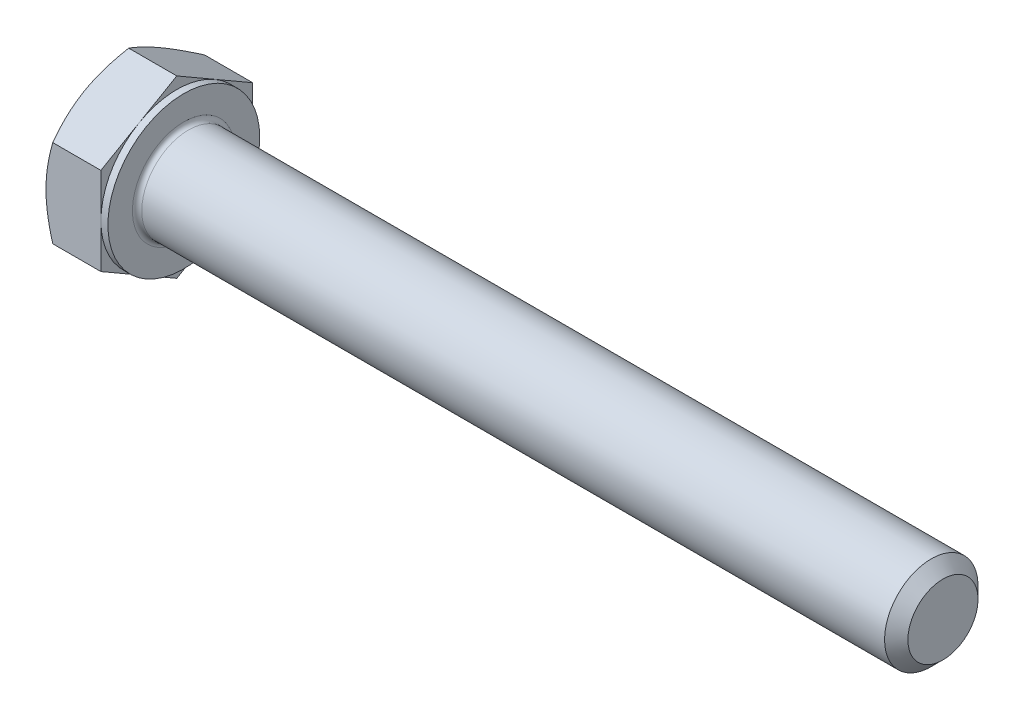
ISO-10303-21;
HEADER;
FILE_DESCRIPTION(('STEP AP214'),'2;1');
FILE_NAME('part.step','',(''),(''),'','','');
FILE_SCHEMA(('AUTOMOTIVE_DESIGN { 1 0 10303 214 1 1 1 1 }'));
ENDSEC;
DATA;
#1=APPLICATION_CONTEXT('core data for automotive mechanical design processes');
#2=APPLICATION_PROTOCOL_DEFINITION('international standard','automotive_design',2000,#1);
#3=PRODUCT_CONTEXT('',#1,'mechanical');
#4=PRODUCT('Part','Part','',(#3));
#5=PRODUCT_RELATED_PRODUCT_CATEGORY('part','',(#4));
#6=PRODUCT_DEFINITION_FORMATION('','',#4);
#7=PRODUCT_DEFINITION_CONTEXT('part definition',#1,'design');
#8=PRODUCT_DEFINITION('design','',#6,#7);
#9=PRODUCT_DEFINITION_SHAPE('','',#8);
#10=(LENGTH_UNIT() NAMED_UNIT(*) SI_UNIT(.MILLI.,.METRE.));
#11=(NAMED_UNIT(*) PLANE_ANGLE_UNIT() SI_UNIT($,.RADIAN.));
#12=(NAMED_UNIT(*) SI_UNIT($,.STERADIAN.) SOLID_ANGLE_UNIT());
#13=UNCERTAINTY_MEASURE_WITH_UNIT(LENGTH_MEASURE(1.E-05),#10,'distance_accuracy_value','');
#14=(GEOMETRIC_REPRESENTATION_CONTEXT(3) GLOBAL_UNCERTAINTY_ASSIGNED_CONTEXT((#13)) GLOBAL_UNIT_ASSIGNED_CONTEXT((#10,
#11,#12)) REPRESENTATION_CONTEXT('',''));
#15=CARTESIAN_POINT('',(0.,0.,0.));
#16=DIRECTION('',(0.,0.,1.));
#17=DIRECTION('',(1.,0.,0.));
#18=AXIS2_PLACEMENT_3D('',#15,#16,#17);
#19=CARTESIAN_POINT('',(5.3,3.75277674973256,-6.5));
#20=DIRECTION('',(0.,-0.866025403784438,0.500000000000001));
#21=DIRECTION('',(0.,-0.500000000000001,-0.866025403784438));
#22=AXIS2_PLACEMENT_3D('',#19,#20,#21);
#23=PLANE('',#22);
#24=DIRECTION('',(0.,0.500000000000001,0.866025403784438));
#25=VECTOR('',#24,1.);
#26=CARTESIAN_POINT('',(4.7,3.75277674973256,-6.5));
#27=LINE('',#26,#25);
#28=CARTESIAN_POINT('',(4.7,3.75277674973256,-6.5));
#29=VERTEX_POINT('',#28);
#30=CARTESIAN_POINT('',(4.7,5.62916512459885,-3.25));
#31=VERTEX_POINT('',#30);
#32=EDGE_CURVE('E179',#29,#31,#27,.T.);
#33=ORIENTED_EDGE('',*,*,#32,.F.);
#34=DIRECTION('',(-1.,0.,0.));
#35=VECTOR('',#34,1.);
#36=CARTESIAN_POINT('',(5.3,3.75277674973256,-6.5));
#37=LINE('',#36,#35);
#38=CARTESIAN_POINT('',(0.580556583600761,3.75277674973256,-6.5));
#39=VERTEX_POINT('',#38);
#40=EDGE_CURVE('E309',#29,#39,#37,.T.);
#41=ORIENTED_EDGE('',*,*,#40,.T.);
#42=CARTESIAN_POINT('',(0.580623251805869,7.50566896951898,0.0002));
#43=CARTESIAN_POINT('',(0.533004423075487,7.4231786300702,-0.14267745905888));
#44=CARTESIAN_POINT('',(0.487546700602708,7.34038072665458,-0.286087634534913));
#45=CARTESIAN_POINT('',(0.401548682023047,7.17411251123976,-0.574072631317195));
#46=CARTESIAN_POINT('',(0.361010507228027,7.09064192560665,-0.718647926571264));
#47=CARTESIAN_POINT('',(0.24757100112321,6.83889369625719,-1.15468865052003));
#48=CARTESIAN_POINT('',(0.183047807128741,6.66962231516081,-1.44787528284632));
#49=CARTESIAN_POINT('',(0.107386583547492,6.41631077211555,-1.88662374554437));
#50=CARTESIAN_POINT('',(0.0858328564569881,6.33302748139454,-2.03087463649469));
#51=CARTESIAN_POINT('',(0.0496903146061193,6.16608458377293,-2.32002821713809));
#52=CARTESIAN_POINT('',(0.0351008844596669,6.08242501078143,-2.46493084809889));
#53=CARTESIAN_POINT('',(0.0132587525073471,5.91496056339806,-2.75498777942832));
#54=CARTESIAN_POINT('',(0.00599772432210794,5.8311559625217,-2.90014160605421));
#55=CARTESIAN_POINT('',(-0.00103969741776869,5.66347396979287,-3.19057533697495));
#56=CARTESIAN_POINT('',(-0.000816322187795487,5.5795965802691,-3.33585523723636));
#57=CARTESIAN_POINT('',(0.010083458515165,5.34979921898453,-3.73387594242649));
#58=CARTESIAN_POINT('',(0.028381817869413,5.20395446807007,-3.98648646102757));
#59=CARTESIAN_POINT('',(0.0864063414576743,4.91323365606635,-4.49002967823568));
#60=CARTESIAN_POINT('',(0.126152338538243,4.76835861741226,-4.74096060593308));
#61=CARTESIAN_POINT('',(0.225505903202148,4.47705272008731,-5.24551722064432));
#62=CARTESIAN_POINT('',(0.285534425638025,4.33065861912702,-5.49907924143591));
#63=CARTESIAN_POINT('',(0.421774992509866,4.04005357906493,-6.00242193575904));
#64=CARTESIAN_POINT('',(0.497955034163591,3.89583891821181,-6.25220905555296));
#65=CARTESIAN_POINT('',(0.580623251805865,3.75266127967873,-6.5002));
#66=B_SPLINE_CURVE_WITH_KNOTS('',3,(#42,#43,#44,#45,#46,#47,#48,#49,#50,#51,#52,#53,#54,#55,#56,
#57,#58,#59,#60,#61,#62,#63,#64,#65),.UNSPECIFIED.,.F.,.F.,(4,2,2,2,2,2,2,2,2,2,2,4),(0.,
0.515105052395588,1.03043143507525,2.06322554824262,2.56697389547996,3.07067772176454,
3.57380860368928,4.0769239424252,4.9527935470566,5.82947446853466,6.72559912449737,
7.61996451221046),.UNSPECIFIED.);
#67=CARTESIAN_POINT('',(0.,5.62916512459885,-3.25000000000001));
#68=VERTEX_POINT('',#67);
#69=EDGE_CURVE('E234',#68,#39,#66,.T.);
#70=ORIENTED_EDGE('',*,*,#69,.F.);
#71=CARTESIAN_POINT('',(0.580556583600765,7.50555349946514,0.));
#72=VERTEX_POINT('',#71);
#73=EDGE_CURVE('E70',#72,#68,#66,.T.);
#74=ORIENTED_EDGE('',*,*,#73,.F.);
#75=DIRECTION('',(-1.,0.,0.));
#76=VECTOR('',#75,1.);
#77=CARTESIAN_POINT('',(5.3,7.50555349946514,0.));
#78=LINE('',#77,#76);
#79=CARTESIAN_POINT('',(4.7,7.50555349946514,0.));
#80=VERTEX_POINT('',#79);
#81=EDGE_CURVE('E301',#80,#72,#78,.T.);
#82=ORIENTED_EDGE('',*,*,#81,.F.);
#83=EDGE_CURVE('E177',#31,#80,#27,.T.);
#84=ORIENTED_EDGE('',*,*,#83,.F.);
#85=EDGE_LOOP('',(#33,#41,#70,#74,#82,#84));
#86=FACE_BOUND('',#85,.T.);
#87=ADVANCED_FACE('F47',(#86),#23,.F.);
#88=CARTESIAN_POINT('',(5.3,7.50555349946514,0.));
#89=DIRECTION('',(0.,-0.866025403784438,-0.500000000000001));
#90=DIRECTION('',(0.,0.500000000000001,-0.866025403784438));
#91=AXIS2_PLACEMENT_3D('',#88,#89,#90);
#92=PLANE('',#91);
#93=DIRECTION('',(0.,-0.500000000000001,0.866025403784438));
#94=VECTOR('',#93,1.);
#95=CARTESIAN_POINT('',(4.7,7.50555349946514,0.));
#96=LINE('',#95,#94);
#97=CARTESIAN_POINT('',(4.7,5.62916512459885,3.25000000000001));
#98=VERTEX_POINT('',#97);
#99=EDGE_CURVE('E176',#80,#98,#96,.T.);
#100=ORIENTED_EDGE('',*,*,#99,.F.);
#101=ORIENTED_EDGE('',*,*,#81,.T.);
#102=CARTESIAN_POINT('',(0.580623251805865,3.75266127967872,6.5002));
#103=CARTESIAN_POINT('',(0.533004423075483,3.8351516191275,6.35732254094112));
#104=CARTESIAN_POINT('',(0.487546700602704,3.91794952254312,6.21391236546509));
#105=CARTESIAN_POINT('',(0.401548682023044,4.08421773795794,5.9259273686828));
#106=CARTESIAN_POINT('',(0.361010507228023,4.16768832359105,5.78135207342873));
#107=CARTESIAN_POINT('',(0.247571001123207,4.41943655294051,5.34531134947996));
#108=CARTESIAN_POINT('',(0.183047807128738,4.58870793403689,5.05212471715368));
#109=CARTESIAN_POINT('',(0.10738658354749,4.84201947708215,4.61337625445563));
#110=CARTESIAN_POINT('',(0.0858328564569865,4.92530276780316,4.46912536350531));
#111=CARTESIAN_POINT('',(0.0496903146061183,5.09224566542477,4.17997178286191));
#112=CARTESIAN_POINT('',(0.035100884459666,5.17590523841627,4.03506915190111));
#113=CARTESIAN_POINT('',(0.0132587525073465,5.34336968579964,3.74501222057168));
#114=CARTESIAN_POINT('',(0.00599772432210779,5.427174286676,3.59985839394579));
#115=CARTESIAN_POINT('',(-0.00103969741776854,5.59485627940483,3.30942466302505));
#116=CARTESIAN_POINT('',(-0.000816322187795452,5.6787336689286,3.16414476276364));
#117=CARTESIAN_POINT('',(0.010083458515165,5.90853103021317,2.76612405757351));
#118=CARTESIAN_POINT('',(0.0283818178694132,6.05437578112763,2.51351353897243));
#119=CARTESIAN_POINT('',(0.0864063414576753,6.34509659313135,2.00997032176432));
#120=CARTESIAN_POINT('',(0.126152338538245,6.48997163178545,1.75903939406692));
#121=CARTESIAN_POINT('',(0.22550590320215,6.78127752911039,1.25448277935568));
#122=CARTESIAN_POINT('',(0.285534425638028,6.92767163007068,1.00092075856409));
#123=CARTESIAN_POINT('',(0.42177499250987,7.21827667013277,0.497578064240955));
#124=CARTESIAN_POINT('',(0.497955034163595,7.36249133098589,0.247790944447036));
#125=CARTESIAN_POINT('',(0.580623251805869,7.50566896951898,-0.000200000000000213));
#126=B_SPLINE_CURVE_WITH_KNOTS('',3,(#102,#103,#104,#105,#106,#107,#108,#109,#110,#111,#112,
#113,#114,#115,#116,#117,#118,#119,#120,#121,#122,#123,#124,#125),.UNSPECIFIED.,.F.,.F.,(4,2,2,
2,2,2,2,2,2,2,2,4),(0.,0.515105052395587,1.03043143507524,2.06322554824262,2.56697389547996,
3.07067772176454,3.57380860368928,4.0769239424252,4.9527935470566,5.82947446853466,
6.72559912449737,7.61996451221046),.UNSPECIFIED.);
#127=CARTESIAN_POINT('',(0.,5.62916512459885,3.25000000000001));
#128=VERTEX_POINT('',#127);
#129=EDGE_CURVE('E231',#128,#72,#126,.T.);
#130=ORIENTED_EDGE('',*,*,#129,.F.);
#131=CARTESIAN_POINT('',(0.58055658360076,3.75277674973256,6.5));
#132=VERTEX_POINT('',#131);
#133=EDGE_CURVE('E245',#132,#128,#126,.T.);
#134=ORIENTED_EDGE('',*,*,#133,.F.);
#135=DIRECTION('',(-1.,0.,0.));
#136=VECTOR('',#135,1.);
#137=CARTESIAN_POINT('',(5.3,3.75277674973256,6.5));
#138=LINE('',#137,#136);
#139=CARTESIAN_POINT('',(4.7,3.75277674973256,6.5));
#140=VERTEX_POINT('',#139);
#141=EDGE_CURVE('E303',#140,#132,#138,.T.);
#142=ORIENTED_EDGE('',*,*,#141,.F.);
#143=EDGE_CURVE('E144',#98,#140,#96,.T.);
#144=ORIENTED_EDGE('',*,*,#143,.F.);
#145=EDGE_LOOP('',(#100,#101,#130,#134,#142,#144));
#146=FACE_BOUND('',#145,.T.);
#147=ADVANCED_FACE('F252',(#146),#92,.F.);
#148=CARTESIAN_POINT('',(5.3,3.75277674973256,6.5));
#149=DIRECTION('',(0.,0.,-1.));
#150=DIRECTION('',(0.,1.,0.));
#151=AXIS2_PLACEMENT_3D('',#148,#149,#150);
#152=PLANE('',#151);
#153=DIRECTION('',(0.,-1.,0.));
#154=VECTOR('',#153,1.);
#155=CARTESIAN_POINT('',(4.7,3.75277674973256,6.5));
#156=LINE('',#155,#154);
#157=CARTESIAN_POINT('',(4.7,0.,6.5));
#158=VERTEX_POINT('',#157);
#159=EDGE_CURVE('E138',#140,#158,#156,.T.);
#160=ORIENTED_EDGE('',*,*,#159,.F.);
#161=ORIENTED_EDGE('',*,*,#141,.T.);
#162=CARTESIAN_POINT('',(3.18835311590246,-10.1137456678934,6.5));
#163=CARTESIAN_POINT('',(3.05034774010468,-9.82952666322138,6.5));
#164=CARTESIAN_POINT('',(2.91365616489938,-9.54465869649274,6.5));
#165=CARTESIAN_POINT('',(2.64363899497542,-8.97327978057922,6.5));
#166=CARTESIAN_POINT('',(2.51031392459097,-8.68676858388472,6.5));
#167=CARTESIAN_POINT('',(2.24710473482719,-8.11029837842689,6.5));
#168=CARTESIAN_POINT('',(2.1172430043868,-7.82032911201512,6.5));
#169=CARTESIAN_POINT('',(1.86279082826903,-7.2380954102234,6.5));
#170=CARTESIAN_POINT('',(1.73820013554674,-6.94583108317207,6.5));
#171=CARTESIAN_POINT('',(1.49176685426962,-6.34906440963036,6.5));
#172=CARTESIAN_POINT('',(1.37014257641266,-6.04447142288872,6.5));
#173=CARTESIAN_POINT('',(1.1360186575815,-5.43173420957316,6.5));
#174=CARTESIAN_POINT('',(1.02352003558022,-5.12358959079846,6.5));
#175=CARTESIAN_POINT('',(0.810575368239919,-4.5038256978226,6.5));
#176=CARTESIAN_POINT('',(0.710105232302007,-4.19221478266993,6.5));
#177=CARTESIAN_POINT('',(0.524420166144455,-3.56452019206012,6.5));
#178=CARTESIAN_POINT('',(0.439200468206419,-3.24843794792921,6.5));
#179=CARTESIAN_POINT('',(0.288524223401198,-2.61335465712783,6.5));
#180=CARTESIAN_POINT('',(0.222961865744749,-2.29437912059505,6.5));
#181=CARTESIAN_POINT('',(0.115312883130725,-1.65238219405863,6.5));
#182=CARTESIAN_POINT('',(0.0732239014690639,-1.3293612135443,6.5));
#183=CARTESIAN_POINT('',(0.0304887136381667,-0.845231171839986,6.5));
#184=CARTESIAN_POINT('',(0.0196493434273843,-0.684982209663104,6.5));
#185=CARTESIAN_POINT('',(0.00475298486143984,-0.364162349065462,6.5));
#186=CARTESIAN_POINT('',(0.000695882908832057,-0.203591456081881,6.5));
#187=CARTESIAN_POINT('',(-0.000531597190095015,0.117577430374295,6.5));
#188=CARTESIAN_POINT('',(0.00229809017012692,0.278175424090141,6.5));
#189=CARTESIAN_POINT('',(0.0147726845547639,0.599108972823504,6.5));
#190=CARTESIAN_POINT('',(0.0244179260500518,0.759444514574217,6.5));
#191=CARTESIAN_POINT('',(0.0554961939342999,1.14369946602534,6.5));
#192=CARTESIAN_POINT('',(0.0801030490514514,1.36736763045086,6.5));
#193=CARTESIAN_POINT('',(0.141246537453377,1.81305591311687,6.5));
#194=CARTESIAN_POINT('',(0.177784759614452,2.03507580783108,6.5));
#195=CARTESIAN_POINT('',(0.303360001332116,2.69839633433795,6.5));
#196=CARTESIAN_POINT('',(0.408335815147595,3.13672010374357,6.5));
#197=CARTESIAN_POINT('',(0.59056459313494,3.79232112918118,6.5));
#198=CARTESIAN_POINT('',(0.656313198979091,4.01299150874073,6.5));
#199=CARTESIAN_POINT('',(0.794681634200732,4.45218859008391,6.5));
#200=CARTESIAN_POINT('',(0.867301513122617,4.67071527639819,6.5));
#201=CARTESIAN_POINT('',(1.01824353854295,5.10569490252726,6.5));
#202=CARTESIAN_POINT('',(1.09656388232839,5.32214847365075,6.5));
#203=CARTESIAN_POINT('',(1.25798086164821,5.75325725773039,6.5));
#204=CARTESIAN_POINT('',(1.34107741035995,5.96791250329556,6.5));
#205=CARTESIAN_POINT('',(1.56029019583041,6.51888445936372,6.5));
#206=CARTESIAN_POINT('',(1.69936356666534,6.85402316813626,6.5));
#207=CARTESIAN_POINT('',(1.98501958087353,7.52109583939392,6.5));
#208=CARTESIAN_POINT('',(2.13160288780791,7.85302951559932,6.5));
#209=CARTESIAN_POINT('',(2.43059748044951,8.51437865518657,6.5));
#210=CARTESIAN_POINT('',(2.58301057596959,8.84379329784093,6.5));
#211=CARTESIAN_POINT('',(2.89234869374926,9.50047798683784,6.5));
#212=CARTESIAN_POINT('',(3.04927357220058,9.82774810112756,6.5));
#213=CARTESIAN_POINT('',(3.36692013130636,10.4809971975748,6.5));
#214=CARTESIAN_POINT('',(3.52764676491733,10.8069737667408,6.5));
#215=CARTESIAN_POINT('',(3.85198555554899,11.4574882901034,6.5));
#216=CARTESIAN_POINT('',(4.01559773123065,11.7820262349792,6.5));
#217=CARTESIAN_POINT('',(4.50986185003773,12.753746811444,6.5));
#218=CARTESIAN_POINT('',(4.84399997978541,13.3991555932469,6.5));
#219=CARTESIAN_POINT('',(5.48575990265919,14.6239779290894,6.5));
#220=CARTESIAN_POINT('',(5.79279643372278,15.2036995760604,6.5));
#221=CARTESIAN_POINT('',(6.4106918822763,16.3611382637875,6.5));
#222=CARTESIAN_POINT('',(6.72155099010109,16.938855202873,6.5));
#223=CARTESIAN_POINT('',(7.34519775439014,18.0910273555999,6.5));
#224=CARTESIAN_POINT('',(7.65797694168864,18.665487160613,6.5));
#225=CARTESIAN_POINT('',(8.28574397153078,19.8131486204439,6.5));
#226=CARTESIAN_POINT('',(8.60073166294279,20.3863503578957,6.5));
#227=CARTESIAN_POINT('',(8.91652967168742,20.9591024521449,6.5));
#228=B_SPLINE_CURVE_WITH_KNOTS('',3,(#162,#163,#164,#165,#166,#167,#168,#169,#170,#171,#172,
#173,#174,#175,#176,#177,#178,#179,#180,#181,#182,#183,#184,#185,#186,#187,#188,#189,#190,#191,
#192,#193,#194,#195,#196,#197,#198,#199,#200,#201,#202,#203,#204,#205,#206,#207,#208,#209,#210,
#211,#212,#213,#214,#215,#216,#217,#218,#219,#220,#221,#222,#223,#224,#225,#226,#227),
.UNSPECIFIED.,.F.,.F.,(4,2,2,2,2,2,2,2,2,2,2,2,2,2,2,2,2,2,2,2,2,2,2,2,2,2,2,2,2,2,2,2,4),(0.,
0.947868666702312,1.89588406483492,2.84900320930536,3.80207763304314,4.7858977408271,
5.76982755141752,6.75175256246685,7.73337005764394,8.70960474890992,9.68574140951124,
10.1674651053568,10.6491807326436,11.1309009419855,11.6126447932157,12.287317572382,
12.9620802330384,14.312318438093,15.0030310344276,15.6937486114326,16.3842486973571,
17.0747362352244,18.1631508683747,19.2516618378194,20.3405135142583,21.4293305231019,
22.5196540547637,23.6099846401957,25.7902468235016,27.7582608872418,29.7263733429304,
31.6886408595598,33.6507753806319),.UNSPECIFIED.);
#229=CARTESIAN_POINT('',(0.,0.,6.5));
#230=VERTEX_POINT('',#229);
#231=EDGE_CURVE('E246',#230,#132,#228,.T.);
#232=ORIENTED_EDGE('',*,*,#231,.F.);
#233=CARTESIAN_POINT('',(0.580556583600765,-3.75277674973258,6.5));
#234=VERTEX_POINT('',#233);
#235=EDGE_CURVE('E310',#234,#230,#228,.T.);
#236=ORIENTED_EDGE('',*,*,#235,.F.);
#237=DIRECTION('',(-1.,0.,0.));
#238=VECTOR('',#237,1.);
#239=CARTESIAN_POINT('',(5.3,-3.75277674973258,6.5));
#240=LINE('',#239,#238);
#241=CARTESIAN_POINT('',(4.7,-3.75277674973258,6.5));
#242=VERTEX_POINT('',#241);
#243=EDGE_CURVE('E170',#242,#234,#240,.T.);
#244=ORIENTED_EDGE('',*,*,#243,.F.);
#245=EDGE_CURVE('E148',#158,#242,#156,.T.);
#246=ORIENTED_EDGE('',*,*,#245,.F.);
#247=EDGE_LOOP('',(#160,#161,#232,#236,#244,#246));
#248=FACE_BOUND('',#247,.T.);
#249=ADVANCED_FACE('F168',(#248),#152,.F.);
#250=CARTESIAN_POINT('',(5.3,-7.50555349946515,0.));
#251=DIRECTION('',(0.,0.866025403784438,-0.500000000000001));
#252=DIRECTION('',(0.,0.500000000000001,0.866025403784438));
#253=AXIS2_PLACEMENT_3D('',#250,#251,#252);
#254=PLANE('',#253);
#255=DIRECTION('',(0.,-0.500000000000001,-0.866025403784438));
#256=VECTOR('',#255,1.);
#257=CARTESIAN_POINT('',(4.7,-7.50555349946515,0.));
#258=LINE('',#257,#256);
#259=CARTESIAN_POINT('',(4.7,-5.62916512459885,3.25));
#260=VERTEX_POINT('',#259);
#261=EDGE_CURVE('E155',#242,#260,#258,.T.);
#262=ORIENTED_EDGE('',*,*,#261,.F.);
#263=ORIENTED_EDGE('',*,*,#243,.T.);
#264=CARTESIAN_POINT('',(0.580623251805877,-7.50566896951899,-0.000199999999999834));
#265=CARTESIAN_POINT('',(0.533004423075495,-7.42317863007022,0.142677459058881));
#266=CARTESIAN_POINT('',(0.487546700602716,-7.3403807266546,0.286087634534913));
#267=CARTESIAN_POINT('',(0.401548682023055,-7.17411251123977,0.574072631317196));
#268=CARTESIAN_POINT('',(0.361010507228034,-7.09064192560666,0.718647926571265));
#269=CARTESIAN_POINT('',(0.247571001123217,-6.8388936962572,1.15468865052004));
#270=CARTESIAN_POINT('',(0.183047807128747,-6.66962231516082,1.44787528284632));
#271=CARTESIAN_POINT('',(0.107386583547499,-6.41631077211556,1.88662374554438));
#272=CARTESIAN_POINT('',(0.0858328564569955,-6.33302748139455,2.03087463649469));
#273=CARTESIAN_POINT('',(0.0496903146061269,-6.16608458377294,2.32002821713809));
#274=CARTESIAN_POINT('',(0.0351008844596744,-6.08242501078144,2.46493084809889));
#275=CARTESIAN_POINT('',(0.0132587525073544,-5.91496056339808,2.75498777942832));
#276=CARTESIAN_POINT('',(0.00599772432211532,-5.83115596252171,2.90014160605421));
#277=CARTESIAN_POINT('',(-0.0010396974177613,-5.66347396979288,3.19057533697495));
#278=CARTESIAN_POINT('',(-0.000816322187788147,-5.57959658026911,3.33585523723636));
#279=CARTESIAN_POINT('',(0.0100834585151721,-5.34979921898454,3.7338759424265));
#280=CARTESIAN_POINT('',(0.0283818178694198,-5.20395446807008,3.98648646102758));
#281=CARTESIAN_POINT('',(0.086406341457681,-4.91323365606637,4.49002967823568));
#282=CARTESIAN_POINT('',(0.12615233853825,-4.76835861741227,4.74096060593309));
#283=CARTESIAN_POINT('',(0.225505903202154,-4.47705272008733,5.24551722064432));
#284=CARTESIAN_POINT('',(0.285534425638031,-4.33065861912704,5.49907924143591));
#285=CARTESIAN_POINT('',(0.421774992509871,-4.04005357906495,6.00242193575904));
#286=CARTESIAN_POINT('',(0.497955034163595,-3.89583891821183,6.25220905555296));
#287=CARTESIAN_POINT('',(0.580623251805869,-3.75266127967874,6.5002));
#288=B_SPLINE_CURVE_WITH_KNOTS('',3,(#264,#265,#266,#267,#268,#269,#270,#271,#272,#273,#274,
#275,#276,#277,#278,#279,#280,#281,#282,#283,#284,#285,#286,#287),.UNSPECIFIED.,.F.,.F.,(4,2,2,
2,2,2,2,2,2,2,2,4),(0.,0.515105052395589,1.03043143507525,2.06322554824263,2.56697389547997,
3.07067772176454,3.57380860368928,4.07692394242521,4.95279354705661,5.82947446853467,
6.72559912449737,7.61996451221046),.UNSPECIFIED.);
#289=CARTESIAN_POINT('',(0.,-5.62916512459885,3.25));
#290=VERTEX_POINT('',#289);
#291=EDGE_CURVE('E233',#290,#234,#288,.T.);
#292=ORIENTED_EDGE('',*,*,#291,.F.);
#293=CARTESIAN_POINT('',(0.580556583600772,-7.50555349946515,0.));
#294=VERTEX_POINT('',#293);
#295=EDGE_CURVE('E225',#294,#290,#288,.T.);
#296=ORIENTED_EDGE('',*,*,#295,.F.);
#297=DIRECTION('',(-1.,0.,0.));
#298=VECTOR('',#297,1.);
#299=CARTESIAN_POINT('',(5.3,-7.50555349946515,0.));
#300=LINE('',#299,#298);
#301=CARTESIAN_POINT('',(4.7,-7.50555349946515,0.));
#302=VERTEX_POINT('',#301);
#303=EDGE_CURVE('E306',#302,#294,#300,.T.);
#304=ORIENTED_EDGE('',*,*,#303,.F.);
#305=EDGE_CURVE('E171',#260,#302,#258,.T.);
#306=ORIENTED_EDGE('',*,*,#305,.F.);
#307=EDGE_LOOP('',(#262,#263,#292,#296,#304,#306));
#308=FACE_BOUND('',#307,.T.);
#309=ADVANCED_FACE('F216',(#308),#254,.F.);
#310=CARTESIAN_POINT('',(5.3,-3.75277674973258,-6.5));
#311=DIRECTION('',(0.,0.866025403784438,0.500000000000001));
#312=DIRECTION('',(0.,-0.500000000000001,0.866025403784438));
#313=AXIS2_PLACEMENT_3D('',#310,#311,#312);
#314=PLANE('',#313);
#315=DIRECTION('',(0.,0.500000000000001,-0.866025403784438));
#316=VECTOR('',#315,1.);
#317=CARTESIAN_POINT('',(4.7,-3.75277674973258,-6.5));
#318=LINE('',#317,#316);
#319=CARTESIAN_POINT('',(4.7,-5.62916512459885,-3.25));
#320=VERTEX_POINT('',#319);
#321=EDGE_CURVE('E356',#302,#320,#318,.T.);
#322=ORIENTED_EDGE('',*,*,#321,.F.);
#323=ORIENTED_EDGE('',*,*,#303,.T.);
#324=CARTESIAN_POINT('',(0.580623251805869,-3.75266127967874,-6.5002));
#325=CARTESIAN_POINT('',(0.533004423075488,-3.83515161912751,-6.35732254094112));
#326=CARTESIAN_POINT('',(0.487546700602708,-3.91794952254313,-6.21391236546509));
#327=CARTESIAN_POINT('',(0.401548682023048,-4.08421773795795,-5.9259273686828));
#328=CARTESIAN_POINT('',(0.361010507228028,-4.16768832359106,-5.78135207342873));
#329=CARTESIAN_POINT('',(0.247571001123211,-4.41943655294052,-5.34531134947996));
#330=CARTESIAN_POINT('',(0.183047807128743,-4.58870793403691,-5.05212471715368));
#331=CARTESIAN_POINT('',(0.107386583547495,-4.84201947708216,-4.61337625445563));
#332=CARTESIAN_POINT('',(0.0858328564569917,-4.92530276780317,-4.46912536350531));
#333=CARTESIAN_POINT('',(0.0496903146061239,-5.09224566542478,-4.17997178286191));
#334=CARTESIAN_POINT('',(0.0351008844596718,-5.17590523841629,-4.03506915190111));
#335=CARTESIAN_POINT('',(0.0132587525073524,-5.34336968579965,-3.74501222057168));
#336=CARTESIAN_POINT('',(0.00599772432211344,-5.42717428667601,-3.59985839394579));
#337=CARTESIAN_POINT('',(-0.00103969741776241,-5.59485627940485,-3.30942466302505));
#338=CARTESIAN_POINT('',(-0.00081632218778859,-5.67873366892861,-3.16414476276364));
#339=CARTESIAN_POINT('',(0.0100834585151729,-5.90853103021318,-2.76612405757351));
#340=CARTESIAN_POINT('',(0.0283818178694208,-6.05437578112765,-2.51351353897243));
#341=CARTESIAN_POINT('',(0.086406341457683,-6.34509659313136,-2.00997032176432));
#342=CARTESIAN_POINT('',(0.126152338538253,-6.48997163178546,-1.75903939406692));
#343=CARTESIAN_POINT('',(0.225505903202158,-6.7812775291104,-1.25448277935568));
#344=CARTESIAN_POINT('',(0.285534425638036,-6.92767163007069,-1.00092075856408));
#345=CARTESIAN_POINT('',(0.421774992509878,-7.21827667013278,-0.497578064240954));
#346=CARTESIAN_POINT('',(0.497955034163602,-7.3624913309859,-0.247790944447036));
#347=CARTESIAN_POINT('',(0.580623251805877,-7.50566896951899,0.000200000000000593));
#348=B_SPLINE_CURVE_WITH_KNOTS('',3,(#324,#325,#326,#327,#328,#329,#330,#331,#332,#333,#334,
#335,#336,#337,#338,#339,#340,#341,#342,#343,#344,#345,#346,#347),.UNSPECIFIED.,.F.,.F.,(4,2,2,
2,2,2,2,2,2,2,2,4),(0.,0.515105052395588,1.03043143507525,2.06322554824262,2.56697389547996,
3.07067772176454,3.57380860368928,4.0769239424252,4.9527935470566,5.82947446853467,
6.72559912449737,7.61996451221046),.UNSPECIFIED.);
#349=CARTESIAN_POINT('',(0.,-5.62916512459885,-3.25000000000001));
#350=VERTEX_POINT('',#349);
#351=EDGE_CURVE('E232',#350,#294,#348,.T.);
#352=ORIENTED_EDGE('',*,*,#351,.F.);
#353=CARTESIAN_POINT('',(0.580556583600765,-3.75277674973258,-6.5));
#354=VERTEX_POINT('',#353);
#355=EDGE_CURVE('E193',#354,#350,#348,.T.);
#356=ORIENTED_EDGE('',*,*,#355,.F.);
#357=DIRECTION('',(-1.,0.,0.));
#358=VECTOR('',#357,1.);
#359=CARTESIAN_POINT('',(5.3,-3.75277674973258,-6.5));
#360=LINE('',#359,#358);
#361=CARTESIAN_POINT('',(4.7,-3.75277674973258,-6.5));
#362=VERTEX_POINT('',#361);
#363=EDGE_CURVE('E308',#362,#354,#360,.T.);
#364=ORIENTED_EDGE('',*,*,#363,.F.);
#365=EDGE_CURVE('E166',#320,#362,#318,.T.);
#366=ORIENTED_EDGE('',*,*,#365,.F.);
#367=EDGE_LOOP('',(#322,#323,#352,#356,#364,#366));
#368=FACE_BOUND('',#367,.T.);
#369=ADVANCED_FACE('F209',(#368),#314,.F.);
#370=CARTESIAN_POINT('',(5.3,3.75277674973256,-6.5));
#371=DIRECTION('',(0.,0.,1.));
#372=DIRECTION('',(0.,-1.,0.));
#373=AXIS2_PLACEMENT_3D('',#370,#371,#372);
#374=PLANE('',#373);
#375=DIRECTION('',(0.,1.,0.));
#376=VECTOR('',#375,1.);
#377=CARTESIAN_POINT('',(4.7,3.75277674973256,-6.5));
#378=LINE('',#377,#376);
#379=CARTESIAN_POINT('',(4.7,0.,-6.5));
#380=VERTEX_POINT('',#379);
#381=EDGE_CURVE('E280',#362,#380,#378,.T.);
#382=ORIENTED_EDGE('',*,*,#381,.F.);
#383=ORIENTED_EDGE('',*,*,#363,.T.);
#384=CARTESIAN_POINT('',(3.18835311590246,-10.1137456678934,-6.5));
#385=CARTESIAN_POINT('',(3.05034774010468,-9.82952666322138,-6.5));
#386=CARTESIAN_POINT('',(2.91365616489938,-9.54465869649274,-6.5));
#387=CARTESIAN_POINT('',(2.64363899497541,-8.97327978057922,-6.5));
#388=CARTESIAN_POINT('',(2.51031392459097,-8.68676858388472,-6.5));
#389=CARTESIAN_POINT('',(2.24710473482719,-8.11029837842689,-6.5));
#390=CARTESIAN_POINT('',(2.1172430043868,-7.82032911201512,-6.5));
#391=CARTESIAN_POINT('',(1.86279082826903,-7.2380954102234,-6.5));
#392=CARTESIAN_POINT('',(1.73820013554674,-6.94583108317207,-6.5));
#393=CARTESIAN_POINT('',(1.49176685426961,-6.34906440963036,-6.5));
#394=CARTESIAN_POINT('',(1.37014257641265,-6.04447142288872,-6.5));
#395=CARTESIAN_POINT('',(1.13601865758149,-5.43173420957316,-6.5));
#396=CARTESIAN_POINT('',(1.02352003558022,-5.12358959079846,-6.5));
#397=CARTESIAN_POINT('',(0.810575368239917,-4.5038256978226,-6.5));
#398=CARTESIAN_POINT('',(0.710105232302005,-4.19221478266993,-6.5));
#399=CARTESIAN_POINT('',(0.524420166144454,-3.56452019206012,-6.5));
#400=CARTESIAN_POINT('',(0.439200468206418,-3.24843794792921,-6.5));
#401=CARTESIAN_POINT('',(0.288524223401198,-2.61335465712783,-6.5));
#402=CARTESIAN_POINT('',(0.222961865744749,-2.29437912059505,-6.5));
#403=CARTESIAN_POINT('',(0.115312883130725,-1.65238219405863,-6.5));
#404=CARTESIAN_POINT('',(0.0732239014690639,-1.3293612135443,-6.5));
#405=CARTESIAN_POINT('',(0.0304887136381667,-0.845231171839985,-6.5));
#406=CARTESIAN_POINT('',(0.0196493434273843,-0.684982209663103,-6.5));
#407=CARTESIAN_POINT('',(0.00475298486143982,-0.36416234906546,-6.5));
#408=CARTESIAN_POINT('',(0.000695882908832049,-0.203591456081879,-6.5));
#409=CARTESIAN_POINT('',(-0.000531597190095004,0.117577430374298,-6.5));
#410=CARTESIAN_POINT('',(0.00229809017012692,0.278175424090144,-6.5));
#411=CARTESIAN_POINT('',(0.0147726845547639,0.599108972823506,-6.5));
#412=CARTESIAN_POINT('',(0.0244179260500518,0.759444514574218,-6.5));
#413=CARTESIAN_POINT('',(0.0554961939343001,1.14369946602534,-6.5));
#414=CARTESIAN_POINT('',(0.0801030490514518,1.36736763045086,-6.5));
#415=CARTESIAN_POINT('',(0.141246537453378,1.81305591311688,-6.5));
#416=CARTESIAN_POINT('',(0.177784759614452,2.03507580783108,-6.5));
#417=CARTESIAN_POINT('',(0.303360001332115,2.69839633433796,-6.5));
#418=CARTESIAN_POINT('',(0.408335815147595,3.13672010374357,-6.5));
#419=CARTESIAN_POINT('',(0.590564593134941,3.79232112918118,-6.5));
#420=CARTESIAN_POINT('',(0.656313198979091,4.01299150874073,-6.5));
#421=CARTESIAN_POINT('',(0.794681634200732,4.45218859008391,-6.5));
#422=CARTESIAN_POINT('',(0.867301513122617,4.67071527639819,-6.5));
#423=CARTESIAN_POINT('',(1.01824353854295,5.10569490252726,-6.5));
#424=CARTESIAN_POINT('',(1.09656388232839,5.32214847365076,-6.5));
#425=CARTESIAN_POINT('',(1.25798086164821,5.75325725773039,-6.5));
#426=CARTESIAN_POINT('',(1.34107741035995,5.96791250329556,-6.5));
#427=CARTESIAN_POINT('',(1.56029019583041,6.51888445936372,-6.5));
#428=CARTESIAN_POINT('',(1.69936356666534,6.85402316813627,-6.5));
#429=CARTESIAN_POINT('',(1.98501958087353,7.52109583939393,-6.5));
#430=CARTESIAN_POINT('',(2.13160288780791,7.85302951559933,-6.5));
#431=CARTESIAN_POINT('',(2.43059748044951,8.51437865518658,-6.5));
#432=CARTESIAN_POINT('',(2.58301057596959,8.84379329784094,-6.5));
#433=CARTESIAN_POINT('',(2.89234869374927,9.50047798683784,-6.5));
#434=CARTESIAN_POINT('',(3.04927357220059,9.82774810112757,-6.5));
#435=CARTESIAN_POINT('',(3.36692013130636,10.4809971975748,-6.5));
#436=CARTESIAN_POINT('',(3.52764676491733,10.8069737667408,-6.5));
#437=CARTESIAN_POINT('',(3.85198555554899,11.4574882901034,-6.5));
#438=CARTESIAN_POINT('',(4.01559773123066,11.7820262349792,-6.5));
#439=CARTESIAN_POINT('',(4.50986185003773,12.7537468114441,-6.5));
#440=CARTESIAN_POINT('',(4.84399997978541,13.3991555932469,-6.5));
#441=CARTESIAN_POINT('',(5.48575990265919,14.6239779290894,-6.5));
#442=CARTESIAN_POINT('',(5.79279643372279,15.2036995760604,-6.5));
#443=CARTESIAN_POINT('',(6.4106918822763,16.3611382637875,-6.5));
#444=CARTESIAN_POINT('',(6.72155099010109,16.938855202873,-6.5));
#445=CARTESIAN_POINT('',(7.34519775439015,18.0910273555999,-6.5));
#446=CARTESIAN_POINT('',(7.65797694168864,18.665487160613,-6.5));
#447=CARTESIAN_POINT('',(8.28574397153079,19.8131486204439,-6.5));
#448=CARTESIAN_POINT('',(8.60073166294279,20.3863503578957,-6.5));
#449=CARTESIAN_POINT('',(8.91652967168742,20.9591024521449,-6.5));
#450=B_SPLINE_CURVE_WITH_KNOTS('',3,(#384,#385,#386,#387,#388,#389,#390,#391,#392,#393,#394,
#395,#396,#397,#398,#399,#400,#401,#402,#403,#404,#405,#406,#407,#408,#409,#410,#411,#412,#413,
#414,#415,#416,#417,#418,#419,#420,#421,#422,#423,#424,#425,#426,#427,#428,#429,#430,#431,#432,
#433,#434,#435,#436,#437,#438,#439,#440,#441,#442,#443,#444,#445,#446,#447,#448,#449),
.UNSPECIFIED.,.F.,.F.,(4,2,2,2,2,2,2,2,2,2,2,2,2,2,2,2,2,2,2,2,2,2,2,2,2,2,2,2,2,2,2,2,4),(0.,
0.947868666702312,1.89588406483492,2.84900320930536,3.80207763304314,4.7858977408271,
5.76982755141752,6.75175256246685,7.73337005764394,8.70960474890991,9.68574140951124,
10.1674651053568,10.6491807326436,11.1309009419855,11.6126447932157,12.287317572382,
12.9620802330384,14.312318438093,15.0030310344276,15.6937486114326,16.3842486973571,
17.0747362352244,18.1631508683747,19.2516618378194,20.3405135142583,21.4293305231019,
22.5196540547637,23.6099846401957,25.7902468235016,27.7582608872418,29.7263733429304,
31.6886408595598,33.6507753806319),.UNSPECIFIED.);
#451=CARTESIAN_POINT('',(0.,0.,-6.5));
#452=VERTEX_POINT('',#451);
#453=EDGE_CURVE('E183',#452,#354,#450,.F.);
#454=ORIENTED_EDGE('',*,*,#453,.F.);
#455=EDGE_CURVE('E192',#39,#452,#450,.F.);
#456=ORIENTED_EDGE('',*,*,#455,.F.);
#457=ORIENTED_EDGE('',*,*,#40,.F.);
#458=EDGE_CURVE('E284',#380,#29,#378,.T.);
#459=ORIENTED_EDGE('',*,*,#458,.F.);
#460=EDGE_LOOP('',(#382,#383,#454,#456,#457,#459));
#461=FACE_BOUND('',#460,.T.);
#462=ADVANCED_FACE('F204',(#461),#374,.F.);
#463=CARTESIAN_POINT('',(0.,0.,0.));
#464=DIRECTION('',(1.,0.,0.));
#465=DIRECTION('',(0.,0.,-1.));
#466=AXIS2_PLACEMENT_3D('',#463,#464,#465);
#467=CONICAL_SURFACE('',#466,6.5,1.0471975511966);
#468=ORIENTED_EDGE('',*,*,#355,.T.);
#469=CARTESIAN_POINT('',(0.,0.,0.));
#470=DIRECTION('',(1.,0.,0.));
#471=DIRECTION('',(0.,0.,-1.));
#472=AXIS2_PLACEMENT_3D('',#469,#470,#471);
#473=CIRCLE('',#472,6.5);
#474=EDGE_CURVE('E297',#350,#452,#473,.T.);
#475=ORIENTED_EDGE('',*,*,#474,.T.);
#476=ORIENTED_EDGE('',*,*,#453,.T.);
#477=EDGE_LOOP('',(#468,#475,#476));
#478=FACE_BOUND('',#477,.T.);
#479=ADVANCED_FACE('F208',(#478),#467,.T.);
#480=ORIENTED_EDGE('',*,*,#295,.T.);
#481=EDGE_CURVE('E300',#290,#350,#473,.T.);
#482=ORIENTED_EDGE('',*,*,#481,.T.);
#483=ORIENTED_EDGE('',*,*,#351,.T.);
#484=EDGE_LOOP('',(#480,#482,#483));
#485=FACE_BOUND('',#484,.T.);
#486=ADVANCED_FACE('F353',(#485),#467,.T.);
#487=ORIENTED_EDGE('',*,*,#235,.T.);
#488=EDGE_CURVE('E330',#230,#290,#473,.T.);
#489=ORIENTED_EDGE('',*,*,#488,.T.);
#490=ORIENTED_EDGE('',*,*,#291,.T.);
#491=EDGE_LOOP('',(#487,#489,#490));
#492=FACE_BOUND('',#491,.T.);
#493=ADVANCED_FACE('F200',(#492),#467,.T.);
#494=ORIENTED_EDGE('',*,*,#231,.T.);
#495=ORIENTED_EDGE('',*,*,#133,.T.);
#496=CARTESIAN_POINT('',(0.,0.,0.));
#497=DIRECTION('',(-1.,0.,0.));
#498=DIRECTION('',(0.,0.,1.));
#499=AXIS2_PLACEMENT_3D('',#496,#497,#498);
#500=CIRCLE('',#499,6.5);
#501=EDGE_CURVE('E180',#230,#128,#500,.T.);
#502=ORIENTED_EDGE('',*,*,#501,.F.);
#503=EDGE_LOOP('',(#494,#495,#502));
#504=FACE_BOUND('',#503,.T.);
#505=ADVANCED_FACE('F324',(#504),#467,.T.);
#506=ORIENTED_EDGE('',*,*,#129,.T.);
#507=ORIENTED_EDGE('',*,*,#73,.T.);
#508=EDGE_CURVE('E295',#68,#128,#473,.T.);
#509=ORIENTED_EDGE('',*,*,#508,.T.);
#510=EDGE_LOOP('',(#506,#507,#509));
#511=FACE_BOUND('',#510,.T.);
#512=ADVANCED_FACE('F328',(#511),#467,.T.);
#513=ORIENTED_EDGE('',*,*,#69,.T.);
#514=ORIENTED_EDGE('',*,*,#455,.T.);
#515=EDGE_CURVE('E294',#452,#68,#473,.T.);
#516=ORIENTED_EDGE('',*,*,#515,.T.);
#517=EDGE_LOOP('',(#513,#514,#516));
#518=FACE_BOUND('',#517,.T.);
#519=ADVANCED_FACE('F344',(#518),#467,.T.);
#520=CARTESIAN_POINT('',(0.,7.50555349946514,0.));
#521=DIRECTION('',(1.,0.,0.));
#522=DIRECTION('',(0.,0.,-1.));
#523=AXIS2_PLACEMENT_3D('',#520,#521,#522);
#524=PLANE('',#523);
#525=ORIENTED_EDGE('',*,*,#515,.F.);
#526=ORIENTED_EDGE('',*,*,#474,.F.);
#527=ORIENTED_EDGE('',*,*,#481,.F.);
#528=ORIENTED_EDGE('',*,*,#488,.F.);
#529=ORIENTED_EDGE('',*,*,#501,.T.);
#530=ORIENTED_EDGE('',*,*,#508,.F.);
#531=EDGE_LOOP('',(#525,#526,#527,#528,#529,#530));
#532=FACE_BOUND('',#531,.T.);
#533=ADVANCED_FACE('F211',(#532),#524,.F.);
#534=CARTESIAN_POINT('',(4.7,6.5,0.));
#535=DIRECTION('',(1.,0.,0.));
#536=DIRECTION('',(0.,0.,-1.));
#537=AXIS2_PLACEMENT_3D('',#534,#535,#536);
#538=PLANE('',#537);
#539=ORIENTED_EDGE('',*,*,#32,.T.);
#540=CARTESIAN_POINT('',(4.7,0.,0.));
#541=DIRECTION('',(-1.,0.,0.));
#542=DIRECTION('',(0.,0.,1.));
#543=AXIS2_PLACEMENT_3D('',#540,#541,#542);
#544=CIRCLE('',#543,6.5);
#545=EDGE_CURVE('E62',#31,#380,#544,.T.);
#546=ORIENTED_EDGE('',*,*,#545,.T.);
#547=ORIENTED_EDGE('',*,*,#458,.T.);
#548=EDGE_LOOP('',(#539,#546,#547));
#549=FACE_BOUND('',#548,.T.);
#550=ADVANCED_FACE('F362',(#549),#538,.T.);
#551=ORIENTED_EDGE('',*,*,#83,.T.);
#552=ORIENTED_EDGE('',*,*,#99,.T.);
#553=EDGE_CURVE('E165',#98,#31,#544,.T.);
#554=ORIENTED_EDGE('',*,*,#553,.T.);
#555=EDGE_LOOP('',(#551,#552,#554));
#556=FACE_BOUND('',#555,.T.);
#557=ADVANCED_FACE('F364',(#556),#538,.T.);
#558=ORIENTED_EDGE('',*,*,#143,.T.);
#559=ORIENTED_EDGE('',*,*,#159,.T.);
#560=EDGE_CURVE('E142',#158,#98,#544,.T.);
#561=ORIENTED_EDGE('',*,*,#560,.T.);
#562=EDGE_LOOP('',(#558,#559,#561));
#563=FACE_BOUND('',#562,.T.);
#564=ADVANCED_FACE('F140',(#563),#538,.T.);
#565=ORIENTED_EDGE('',*,*,#245,.T.);
#566=ORIENTED_EDGE('',*,*,#261,.T.);
#567=EDGE_CURVE('E152',#260,#158,#544,.T.);
#568=ORIENTED_EDGE('',*,*,#567,.T.);
#569=EDGE_LOOP('',(#565,#566,#568));
#570=FACE_BOUND('',#569,.T.);
#571=ADVANCED_FACE('F153',(#570),#538,.T.);
#572=ORIENTED_EDGE('',*,*,#305,.T.);
#573=ORIENTED_EDGE('',*,*,#321,.T.);
#574=EDGE_CURVE('E159',#320,#260,#544,.T.);
#575=ORIENTED_EDGE('',*,*,#574,.T.);
#576=EDGE_LOOP('',(#572,#573,#575));
#577=FACE_BOUND('',#576,.T.);
#578=ADVANCED_FACE('F378',(#577),#538,.T.);
#579=ORIENTED_EDGE('',*,*,#365,.T.);
#580=ORIENTED_EDGE('',*,*,#381,.T.);
#581=EDGE_CURVE('E361',#380,#320,#544,.T.);
#582=ORIENTED_EDGE('',*,*,#581,.T.);
#583=EDGE_LOOP('',(#579,#580,#582));
#584=FACE_BOUND('',#583,.T.);
#585=ADVANCED_FACE('F359',(#584),#538,.T.);
#586=CARTESIAN_POINT('',(0.,0.,0.));
#587=DIRECTION('',(-1.,0.,0.));
#588=DIRECTION('',(0.,0.,1.));
#589=AXIS2_PLACEMENT_3D('',#586,#587,#588);
#590=CYLINDRICAL_SURFACE('',#589,6.5);
#591=ORIENTED_EDGE('',*,*,#545,.F.);
#592=ORIENTED_EDGE('',*,*,#553,.F.);
#593=ORIENTED_EDGE('',*,*,#560,.F.);
#594=ORIENTED_EDGE('',*,*,#567,.F.);
#595=ORIENTED_EDGE('',*,*,#574,.F.);
#596=ORIENTED_EDGE('',*,*,#581,.F.);
#597=EDGE_LOOP('',(#591,#592,#593,#594,#595,#596));
#598=FACE_BOUND('',#597,.T.);
#599=CARTESIAN_POINT('',(5.3,0.,0.));
#600=DIRECTION('',(1.,0.,0.));
#601=DIRECTION('',(0.,0.,-1.));
#602=AXIS2_PLACEMENT_3D('',#599,#600,#601);
#603=CIRCLE('',#602,6.5);
#604=CARTESIAN_POINT('',(5.3,0.,-6.5));
#605=VERTEX_POINT('',#604);
#606=EDGE_CURVE('E293',#605,#605,#603,.T.);
#607=ORIENTED_EDGE('',*,*,#606,.F.);
#608=EDGE_LOOP('',(#607));
#609=FACE_BOUND('',#608,.T.);
#610=ADVANCED_FACE('F162',(#598,#609),#590,.T.);
#611=CARTESIAN_POINT('',(70.3,0.,0.));
#612=DIRECTION('',(-1.,0.,0.));
#613=DIRECTION('',(0.,0.,1.));
#614=AXIS2_PLACEMENT_3D('',#611,#612,#613);
#615=PLANE('',#614);
#616=CARTESIAN_POINT('',(70.3,0.,0.));
#617=DIRECTION('',(-1.,0.,0.));
#618=DIRECTION('',(0.,0.,1.));
#619=AXIS2_PLACEMENT_3D('',#616,#617,#618);
#620=CIRCLE('',#619,3.);
#621=CARTESIAN_POINT('',(70.3,0.,3.));
#622=VERTEX_POINT('',#621);
#623=EDGE_CURVE('E275',#622,#622,#620,.F.);
#624=ORIENTED_EDGE('',*,*,#623,.T.);
#625=EDGE_LOOP('',(#624));
#626=FACE_BOUND('',#625,.T.);
#627=ADVANCED_FACE('F372',(#626),#615,.F.);
#628=CARTESIAN_POINT('',(0.,0.,0.));
#629=DIRECTION('',(-1.,0.,0.));
#630=DIRECTION('',(0.,0.,1.));
#631=AXIS2_PLACEMENT_3D('',#628,#629,#630);
#632=CYLINDRICAL_SURFACE('',#631,4.);
#633=CARTESIAN_POINT('',(5.7,0.,0.));
#634=DIRECTION('',(1.,0.,0.));
#635=DIRECTION('',(0.,0.,-1.));
#636=AXIS2_PLACEMENT_3D('',#633,#634,#635);
#637=CIRCLE('',#636,4.);
#638=CARTESIAN_POINT('',(5.7,0.,-4.));
#639=VERTEX_POINT('',#638);
#640=EDGE_CURVE('E12',#639,#639,#637,.T.);
#641=ORIENTED_EDGE('',*,*,#640,.T.);
#642=EDGE_LOOP('',(#641));
#643=FACE_BOUND('',#642,.T.);
#644=CARTESIAN_POINT('',(69.3,0.,0.));
#645=DIRECTION('',(-1.,0.,0.));
#646=DIRECTION('',(0.,0.,1.));
#647=AXIS2_PLACEMENT_3D('',#644,#645,#646);
#648=CIRCLE('',#647,4.);
#649=CARTESIAN_POINT('',(69.3,0.,4.));
#650=VERTEX_POINT('',#649);
#651=EDGE_CURVE('E278',#650,#650,#648,.T.);
#652=ORIENTED_EDGE('',*,*,#651,.T.);
#653=EDGE_LOOP('',(#652));
#654=FACE_BOUND('',#653,.T.);
#655=ADVANCED_FACE('F270',(#643,#654),#632,.T.);
#656=CARTESIAN_POINT('',(5.3,7.50555349946514,0.));
#657=DIRECTION('',(1.,0.,0.));
#658=DIRECTION('',(0.,0.,-1.));
#659=AXIS2_PLACEMENT_3D('',#656,#657,#658);
#660=PLANE('',#659);
#661=CARTESIAN_POINT('',(5.3,0.,0.));
#662=DIRECTION('',(1.,0.,0.));
#663=DIRECTION('',(0.,0.,-1.));
#664=AXIS2_PLACEMENT_3D('',#661,#662,#663);
#665=CIRCLE('',#664,4.4);
#666=CARTESIAN_POINT('',(5.3,0.,-4.4));
#667=VERTEX_POINT('',#666);
#668=EDGE_CURVE('E55',#667,#667,#665,.F.);
#669=ORIENTED_EDGE('',*,*,#668,.T.);
#670=EDGE_LOOP('',(#669));
#671=FACE_BOUND('',#670,.T.);
#672=ORIENTED_EDGE('',*,*,#606,.T.);
#673=EDGE_LOOP('',(#672));
#674=FACE_BOUND('',#673,.T.);
#675=ADVANCED_FACE('F261',(#671,#674),#660,.T.);
#676=CARTESIAN_POINT('',(69.3,0.,0.));
#677=DIRECTION('',(-1.,0.,0.));
#678=DIRECTION('',(0.,0.,1.));
#679=AXIS2_PLACEMENT_3D('',#676,#677,#678);
#680=CONICAL_SURFACE('',#679,4.,0.785398163397446);
#681=ORIENTED_EDGE('',*,*,#623,.F.);
#682=EDGE_LOOP('',(#681));
#683=FACE_BOUND('',#682,.T.);
#684=ORIENTED_EDGE('',*,*,#651,.F.);
#685=EDGE_LOOP('',(#684));
#686=FACE_BOUND('',#685,.T.);
#687=ADVANCED_FACE('F259',(#683,#686),#680,.T.);
#688=CARTESIAN_POINT('',(5.7,0.,0.));
#689=DIRECTION('',(1.,0.,0.));
#690=DIRECTION('',(0.,0.,-1.));
#691=AXIS2_PLACEMENT_3D('',#688,#689,#690);
#692=TOROIDAL_SURFACE('',#691,4.4,0.4);
#693=ORIENTED_EDGE('',*,*,#640,.F.);
#694=EDGE_LOOP('',(#693));
#695=FACE_BOUND('',#694,.T.);
#696=ORIENTED_EDGE('',*,*,#668,.F.);
#697=EDGE_LOOP('',(#696));
#698=FACE_BOUND('',#697,.T.);
#699=ADVANCED_FACE('F49',(#695,#698),#692,.F.);
#700=CLOSED_SHELL('',(#87,#147,#249,#309,#369,#462,#479,#486,#493,#505,#512,#519,#533,#550,#557,
#564,#571,#578,#585,#610,#627,#655,#675,#687,#699));
#701=MANIFOLD_SOLID_BREP('B2',#700);
#702=ADVANCED_BREP_SHAPE_REPRESENTATION('',(#18,#701),#14);
#703=SHAPE_DEFINITION_REPRESENTATION(#9,#702);
ENDSEC;
END-ISO-10303-21;
